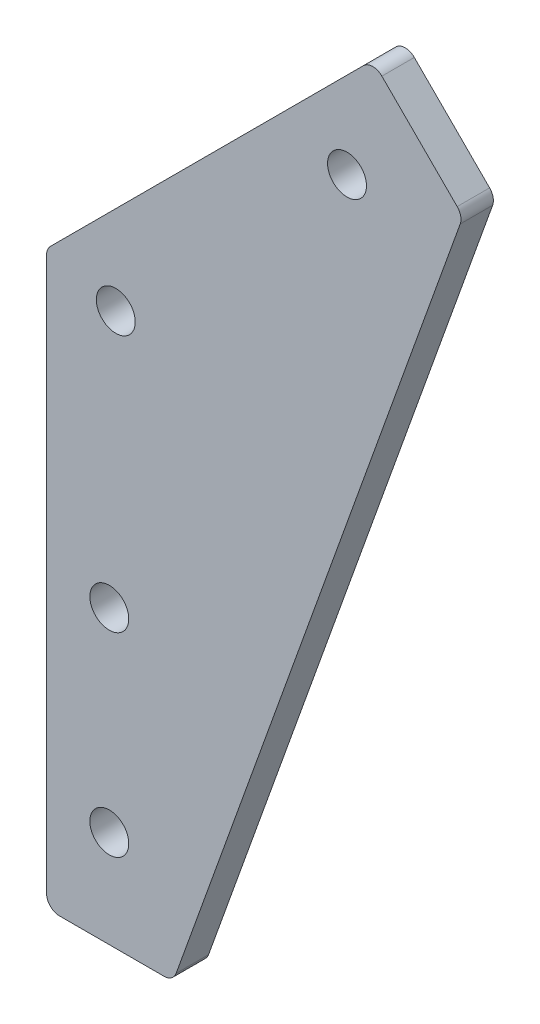
ISO-10303-21;
HEADER;
FILE_DESCRIPTION(('STEP AP214'),'2;1');
FILE_NAME('part.step','',(''),(''),'','','');
FILE_SCHEMA(('AUTOMOTIVE_DESIGN { 1 0 10303 214 1 1 1 1 }'));
ENDSEC;
DATA;
#1=APPLICATION_CONTEXT('core data for automotive mechanical design processes');
#2=APPLICATION_PROTOCOL_DEFINITION('international standard','automotive_design',2000,#1);
#3=PRODUCT_CONTEXT('',#1,'mechanical');
#4=PRODUCT('Part','Part','',(#3));
#5=PRODUCT_RELATED_PRODUCT_CATEGORY('part','',(#4));
#6=PRODUCT_DEFINITION_FORMATION('','',#4);
#7=PRODUCT_DEFINITION_CONTEXT('part definition',#1,'design');
#8=PRODUCT_DEFINITION('design','',#6,#7);
#9=PRODUCT_DEFINITION_SHAPE('','',#8);
#10=(LENGTH_UNIT() NAMED_UNIT(*) SI_UNIT(.MILLI.,.METRE.));
#11=(NAMED_UNIT(*) PLANE_ANGLE_UNIT() SI_UNIT($,.RADIAN.));
#12=(NAMED_UNIT(*) SI_UNIT($,.STERADIAN.) SOLID_ANGLE_UNIT());
#13=UNCERTAINTY_MEASURE_WITH_UNIT(LENGTH_MEASURE(1.E-05),#10,'distance_accuracy_value','');
#14=(GEOMETRIC_REPRESENTATION_CONTEXT(3) GLOBAL_UNCERTAINTY_ASSIGNED_CONTEXT((#13)) GLOBAL_UNIT_ASSIGNED_CONTEXT((#10,
#11,#12)) REPRESENTATION_CONTEXT('',''));
#15=CARTESIAN_POINT('',(0.,0.,0.));
#16=DIRECTION('',(0.,0.,1.));
#17=DIRECTION('',(1.,0.,0.));
#18=AXIS2_PLACEMENT_3D('',#15,#16,#17);
#19=CARTESIAN_POINT('',(12.4503702457408,68.7965035766205,1.));
#20=DIRECTION('',(0.,0.,1.));
#21=DIRECTION('',(1.,0.,0.));
#22=AXIS2_PLACEMENT_3D('',#19,#20,#21);
#23=PLANE('',#22);
#24=CARTESIAN_POINT('',(-9.83,15.,1.));
#25=DIRECTION('',(0.,0.,-1.));
#26=DIRECTION('',(1.,0.,0.));
#27=AXIS2_PLACEMENT_3D('',#24,#25,#26);
#28=CIRCLE('',#27,3.);
#29=CARTESIAN_POINT('',(-6.83,15.,1.));
#30=VERTEX_POINT('',#29);
#31=EDGE_CURVE('E11',#30,#30,#28,.T.);
#32=ORIENTED_EDGE('',*,*,#31,.T.);
#33=EDGE_LOOP('',(#32));
#34=FACE_BOUND('',#33,.T.);
#35=CARTESIAN_POINT('',(-9.83,45.,1.));
#36=DIRECTION('',(0.,0.,-1.));
#37=DIRECTION('',(1.,0.,0.));
#38=AXIS2_PLACEMENT_3D('',#35,#36,#37);
#39=CIRCLE('',#38,3.);
#40=CARTESIAN_POINT('',(-6.83,45.,1.));
#41=VERTEX_POINT('',#40);
#42=EDGE_CURVE('E23',#41,#41,#39,.T.);
#43=ORIENTED_EDGE('',*,*,#42,.T.);
#44=EDGE_LOOP('',(#43));
#45=FACE_BOUND('',#44,.T.);
#46=CARTESIAN_POINT('',(-8.83,85.15,1.));
#47=DIRECTION('',(0.,0.,-1.));
#48=DIRECTION('',(1.,0.,0.));
#49=AXIS2_PLACEMENT_3D('',#46,#47,#48);
#50=CIRCLE('',#49,3.);
#51=CARTESIAN_POINT('',(-5.83,85.15,1.));
#52=VERTEX_POINT('',#51);
#53=EDGE_CURVE('E244',#52,#52,#50,.T.);
#54=ORIENTED_EDGE('',*,*,#53,.T.);
#55=EDGE_LOOP('',(#54));
#56=FACE_BOUND('',#55,.T.);
#57=CARTESIAN_POINT('',(26.8247068584462,121.172958261932,1.));
#58=DIRECTION('',(0.,0.,-1.));
#59=DIRECTION('',(1.,0.,0.));
#60=AXIS2_PLACEMENT_3D('',#57,#58,#59);
#61=CIRCLE('',#60,3.);
#62=CARTESIAN_POINT('',(29.8247068584462,121.172958261932,1.));
#63=VERTEX_POINT('',#62);
#64=EDGE_CURVE('E239',#63,#63,#61,.T.);
#65=ORIENTED_EDGE('',*,*,#64,.T.);
#66=EDGE_LOOP('',(#65));
#67=FACE_BOUND('',#66,.T.);
#68=CARTESIAN_POINT('',(30.7894342779873,135.593007153241,1.));
#69=DIRECTION('',(0.,0.,1.));
#70=DIRECTION('',(0.707106781186543,0.707106781186552,0.));
#71=AXIS2_PLACEMENT_3D('',#68,#69,#70);
#72=CIRCLE('',#71,2.);
#73=CARTESIAN_POINT('',(32.2036478403604,137.007220715614,1.));
#74=VERTEX_POINT('',#73);
#75=CARTESIAN_POINT('',(29.3752207156142,137.007220715614,1.));
#76=VERTEX_POINT('',#75);
#77=EDGE_CURVE('E30',#74,#76,#72,.T.);
#78=ORIENTED_EDGE('',*,*,#77,.T.);
#79=DIRECTION('',(-0.707106781186548,-0.707106781186547,0.));
#80=VECTOR('',#79,1.);
#81=CARTESIAN_POINT('',(-18.9142135623731,88.7177864376269,1.));
#82=LINE('',#81,#80);
#83=CARTESIAN_POINT('',(-18.9142135623731,88.7177864376269,1.));
#84=VERTEX_POINT('',#83);
#85=EDGE_CURVE('E35',#76,#84,#82,.T.);
#86=ORIENTED_EDGE('',*,*,#85,.T.);
#87=CARTESIAN_POINT('',(-17.5,87.3035728752538,1.));
#88=DIRECTION('',(0.,0.,1.));
#89=DIRECTION('',(-0.707106781186539,0.707106781186556,0.));
#90=AXIS2_PLACEMENT_3D('',#87,#88,#89);
#91=CIRCLE('',#90,1.99999999999995);
#92=CARTESIAN_POINT('',(-19.5,87.3035728752538,1.));
#93=VERTEX_POINT('',#92);
#94=EDGE_CURVE('E229',#84,#93,#91,.T.);
#95=ORIENTED_EDGE('',*,*,#94,.T.);
#96=DIRECTION('',(0.,-1.,0.));
#97=VECTOR('',#96,1.);
#98=CARTESIAN_POINT('',(-19.5,2.,1.));
#99=LINE('',#98,#97);
#100=CARTESIAN_POINT('',(-19.5,2.,1.));
#101=VERTEX_POINT('',#100);
#102=EDGE_CURVE('E225',#93,#101,#99,.T.);
#103=ORIENTED_EDGE('',*,*,#102,.T.);
#104=CARTESIAN_POINT('',(-17.5,2.,1.));
#105=DIRECTION('',(0.,0.,1.));
#106=DIRECTION('',(-1.,0.,0.));
#107=AXIS2_PLACEMENT_3D('',#104,#105,#106);
#108=CIRCLE('',#107,2.);
#109=CARTESIAN_POINT('',(-17.5,0.,1.));
#110=VERTEX_POINT('',#109);
#111=EDGE_CURVE('E221',#101,#110,#108,.T.);
#112=ORIENTED_EDGE('',*,*,#111,.T.);
#113=DIRECTION('',(1.,0.,0.));
#114=VECTOR('',#113,1.);
#115=CARTESIAN_POINT('',(-1.40680134724384,0.,1.));
#116=LINE('',#115,#114);
#117=CARTESIAN_POINT('',(-1.40680134724384,0.,1.));
#118=VERTEX_POINT('',#117);
#119=EDGE_CURVE('E217',#110,#118,#116,.T.);
#120=ORIENTED_EDGE('',*,*,#119,.T.);
#121=CARTESIAN_POINT('',(-1.40680134724384,2.,1.));
#122=DIRECTION('',(0.,0.,1.));
#123=DIRECTION('',(0.,-1.,0.));
#124=AXIS2_PLACEMENT_3D('',#121,#122,#123);
#125=CIRCLE('',#124,2.);
#126=CARTESIAN_POINT('',(0.47549357060138,1.32400751316744,1.));
#127=VERTEX_POINT('',#126);
#128=EDGE_CURVE('E213',#118,#127,#125,.T.);
#129=ORIENTED_EDGE('',*,*,#128,.T.);
#130=DIRECTION('',(0.337996243416279,0.941147458922609,0.));
#131=VECTOR('',#130,1.);
#132=CARTESIAN_POINT('',(0.475493570601379,1.32400751316744,1.));
#133=LINE('',#132,#131);
#134=CARTESIAN_POINT('',(44.2830354093269,123.305708452914,1.));
#135=VERTEX_POINT('',#134);
#136=EDGE_CURVE('E209',#127,#135,#133,.T.);
#137=ORIENTED_EDGE('',*,*,#136,.T.);
#138=CARTESIAN_POINT('',(42.4007404914815,123.981700939747,1.));
#139=DIRECTION('',(0.,0.,1.));
#140=DIRECTION('',(0.94114745892262,-0.337996243416249,0.));
#141=AXIS2_PLACEMENT_3D('',#138,#139,#140);
#142=CIRCLE('',#141,2.00000000000015);
#143=CARTESIAN_POINT('',(43.8149540538548,125.39591450212,1.));
#144=VERTEX_POINT('',#143);
#145=EDGE_CURVE('E205',#135,#144,#142,.T.);
#146=ORIENTED_EDGE('',*,*,#145,.T.);
#147=DIRECTION('',(-0.707106781186548,0.707106781186547,0.));
#148=VECTOR('',#147,1.);
#149=CARTESIAN_POINT('',(32.2036478403604,137.007220715614,1.));
#150=LINE('',#149,#148);
#151=EDGE_CURVE('E110',#144,#74,#150,.T.);
#152=ORIENTED_EDGE('',*,*,#151,.T.);
#153=EDGE_LOOP('',(#78,#86,#95,#103,#112,#120,#129,#137,#146,#152));
#154=FACE_BOUND('',#153,.T.);
#155=ADVANCED_FACE('F16',(#34,#45,#56,#67,#154),#23,.T.);
#156=CARTESIAN_POINT('',(30.7894342779873,135.593007153241,0.));
#157=DIRECTION('',(0.,0.,1.));
#158=DIRECTION('',(0.707106781186543,0.707106781186552,0.));
#159=AXIS2_PLACEMENT_3D('',#156,#157,#158);
#160=CYLINDRICAL_SURFACE('',#159,2.);
#161=DIRECTION('',(0.,0.,1.));
#162=VECTOR('',#161,1.);
#163=CARTESIAN_POINT('',(29.3752207156142,137.007220715614,0.));
#164=LINE('',#163,#162);
#165=CARTESIAN_POINT('',(29.3752207156142,137.007220715614,-4.));
#166=VERTEX_POINT('',#165);
#167=EDGE_CURVE('E198',#166,#76,#164,.T.);
#168=ORIENTED_EDGE('',*,*,#167,.T.);
#169=ORIENTED_EDGE('',*,*,#77,.F.);
#170=DIRECTION('',(0.,0.,-1.));
#171=VECTOR('',#170,1.);
#172=CARTESIAN_POINT('',(32.2036478403604,137.007220715614,0.));
#173=LINE('',#172,#171);
#174=CARTESIAN_POINT('',(32.2036478403604,137.007220715614,-4.));
#175=VERTEX_POINT('',#174);
#176=EDGE_CURVE('E194',#74,#175,#173,.T.);
#177=ORIENTED_EDGE('',*,*,#176,.T.);
#178=CARTESIAN_POINT('',(30.7894342779873,135.593007153241,-4.));
#179=DIRECTION('',(0.,0.,-1.));
#180=DIRECTION('',(0.707106781186543,0.707106781186552,0.));
#181=AXIS2_PLACEMENT_3D('',#178,#179,#180);
#182=CIRCLE('',#181,2.);
#183=EDGE_CURVE('E115',#166,#175,#182,.T.);
#184=ORIENTED_EDGE('',*,*,#183,.F.);
#185=EDGE_LOOP('',(#168,#169,#177,#184));
#186=FACE_BOUND('',#185,.T.);
#187=ADVANCED_FACE('F269',(#186),#160,.T.);
#188=CARTESIAN_POINT('',(29.3752207156142,137.007220715614,0.));
#189=DIRECTION('',(-0.707106781186547,0.707106781186548,0.));
#190=DIRECTION('',(-0.707106781186548,-0.707106781186547,0.));
#191=AXIS2_PLACEMENT_3D('',#188,#189,#190);
#192=PLANE('',#191);
#193=DIRECTION('',(0.,0.,1.));
#194=VECTOR('',#193,1.);
#195=CARTESIAN_POINT('',(-18.9142135623731,88.7177864376269,0.));
#196=LINE('',#195,#194);
#197=CARTESIAN_POINT('',(-18.9142135623731,88.7177864376269,-4.));
#198=VERTEX_POINT('',#197);
#199=EDGE_CURVE('E187',#198,#84,#196,.T.);
#200=ORIENTED_EDGE('',*,*,#199,.T.);
#201=ORIENTED_EDGE('',*,*,#85,.F.);
#202=ORIENTED_EDGE('',*,*,#167,.F.);
#203=DIRECTION('',(0.707106781186548,0.707106781186547,0.));
#204=VECTOR('',#203,1.);
#205=CARTESIAN_POINT('',(-18.9142135623731,88.7177864376269,-4.));
#206=LINE('',#205,#204);
#207=EDGE_CURVE('E183',#198,#166,#206,.T.);
#208=ORIENTED_EDGE('',*,*,#207,.F.);
#209=EDGE_LOOP('',(#200,#201,#202,#208));
#210=FACE_BOUND('',#209,.T.);
#211=ADVANCED_FACE('F274',(#210),#192,.T.);
#212=CARTESIAN_POINT('',(-17.5,87.3035728752538,0.));
#213=DIRECTION('',(0.,0.,1.));
#214=DIRECTION('',(-0.707106781186539,0.707106781186556,0.));
#215=AXIS2_PLACEMENT_3D('',#212,#213,#214);
#216=CYLINDRICAL_SURFACE('',#215,1.99999999999995);
#217=DIRECTION('',(0.,0.,1.));
#218=VECTOR('',#217,1.);
#219=CARTESIAN_POINT('',(-19.5,87.3035728752538,0.));
#220=LINE('',#219,#218);
#221=CARTESIAN_POINT('',(-19.5,87.3035728752538,-4.));
#222=VERTEX_POINT('',#221);
#223=EDGE_CURVE('E178',#222,#93,#220,.T.);
#224=ORIENTED_EDGE('',*,*,#223,.T.);
#225=ORIENTED_EDGE('',*,*,#94,.F.);
#226=ORIENTED_EDGE('',*,*,#199,.F.);
#227=CARTESIAN_POINT('',(-17.5,87.3035728752538,-4.));
#228=DIRECTION('',(0.,0.,-1.));
#229=DIRECTION('',(-0.707106781186539,0.707106781186556,0.));
#230=AXIS2_PLACEMENT_3D('',#227,#228,#229);
#231=CIRCLE('',#230,1.99999999999995);
#232=EDGE_CURVE('E173',#222,#198,#231,.T.);
#233=ORIENTED_EDGE('',*,*,#232,.F.);
#234=EDGE_LOOP('',(#224,#225,#226,#233));
#235=FACE_BOUND('',#234,.T.);
#236=ADVANCED_FACE('F281',(#235),#216,.T.);
#237=CARTESIAN_POINT('',(-19.5,87.3035728752538,0.));
#238=DIRECTION('',(-1.,0.,0.));
#239=DIRECTION('',(0.,-1.,0.));
#240=AXIS2_PLACEMENT_3D('',#237,#238,#239);
#241=PLANE('',#240);
#242=DIRECTION('',(0.,0.,1.));
#243=VECTOR('',#242,1.);
#244=CARTESIAN_POINT('',(-19.5,2.,0.));
#245=LINE('',#244,#243);
#246=CARTESIAN_POINT('',(-19.5,2.,-4.));
#247=VERTEX_POINT('',#246);
#248=EDGE_CURVE('E168',#247,#101,#245,.T.);
#249=ORIENTED_EDGE('',*,*,#248,.T.);
#250=ORIENTED_EDGE('',*,*,#102,.F.);
#251=ORIENTED_EDGE('',*,*,#223,.F.);
#252=DIRECTION('',(0.,1.,0.));
#253=VECTOR('',#252,1.);
#254=CARTESIAN_POINT('',(-19.5,2.,-4.));
#255=LINE('',#254,#253);
#256=EDGE_CURVE('E163',#247,#222,#255,.T.);
#257=ORIENTED_EDGE('',*,*,#256,.F.);
#258=EDGE_LOOP('',(#249,#250,#251,#257));
#259=FACE_BOUND('',#258,.T.);
#260=ADVANCED_FACE('F287',(#259),#241,.T.);
#261=CARTESIAN_POINT('',(-17.5,2.,0.));
#262=DIRECTION('',(0.,0.,1.));
#263=DIRECTION('',(-1.,0.,0.));
#264=AXIS2_PLACEMENT_3D('',#261,#262,#263);
#265=CYLINDRICAL_SURFACE('',#264,2.);
#266=DIRECTION('',(0.,0.,1.));
#267=VECTOR('',#266,1.);
#268=CARTESIAN_POINT('',(-17.5,0.,0.));
#269=LINE('',#268,#267);
#270=CARTESIAN_POINT('',(-17.5,0.,-4.));
#271=VERTEX_POINT('',#270);
#272=EDGE_CURVE('E158',#271,#110,#269,.T.);
#273=ORIENTED_EDGE('',*,*,#272,.T.);
#274=ORIENTED_EDGE('',*,*,#111,.F.);
#275=ORIENTED_EDGE('',*,*,#248,.F.);
#276=CARTESIAN_POINT('',(-17.5,2.,-4.));
#277=DIRECTION('',(0.,0.,-1.));
#278=DIRECTION('',(-1.,0.,0.));
#279=AXIS2_PLACEMENT_3D('',#276,#277,#278);
#280=CIRCLE('',#279,2.);
#281=EDGE_CURVE('E153',#271,#247,#280,.T.);
#282=ORIENTED_EDGE('',*,*,#281,.F.);
#283=EDGE_LOOP('',(#273,#274,#275,#282));
#284=FACE_BOUND('',#283,.T.);
#285=ADVANCED_FACE('F291',(#284),#265,.T.);
#286=CARTESIAN_POINT('',(-17.5,0.,0.));
#287=DIRECTION('',(0.,-1.,0.));
#288=DIRECTION('',(1.,0.,0.));
#289=AXIS2_PLACEMENT_3D('',#286,#287,#288);
#290=PLANE('',#289);
#291=DIRECTION('',(0.,0.,1.));
#292=VECTOR('',#291,1.);
#293=CARTESIAN_POINT('',(-1.40680134724384,0.,0.));
#294=LINE('',#293,#292);
#295=CARTESIAN_POINT('',(-1.40680134724384,0.,-4.));
#296=VERTEX_POINT('',#295);
#297=EDGE_CURVE('E148',#296,#118,#294,.T.);
#298=ORIENTED_EDGE('',*,*,#297,.T.);
#299=ORIENTED_EDGE('',*,*,#119,.F.);
#300=ORIENTED_EDGE('',*,*,#272,.F.);
#301=DIRECTION('',(-1.,0.,0.));
#302=VECTOR('',#301,1.);
#303=CARTESIAN_POINT('',(-1.40680134724384,0.,-4.));
#304=LINE('',#303,#302);
#305=EDGE_CURVE('E143',#296,#271,#304,.T.);
#306=ORIENTED_EDGE('',*,*,#305,.F.);
#307=EDGE_LOOP('',(#298,#299,#300,#306));
#308=FACE_BOUND('',#307,.T.);
#309=ADVANCED_FACE('F295',(#308),#290,.T.);
#310=CARTESIAN_POINT('',(-1.40680134724384,2.,0.));
#311=DIRECTION('',(0.,0.,1.));
#312=DIRECTION('',(0.,-1.,0.));
#313=AXIS2_PLACEMENT_3D('',#310,#311,#312);
#314=CYLINDRICAL_SURFACE('',#313,2.);
#315=DIRECTION('',(0.,0.,1.));
#316=VECTOR('',#315,1.);
#317=CARTESIAN_POINT('',(0.475493570601378,1.32400751316744,0.));
#318=LINE('',#317,#316);
#319=CARTESIAN_POINT('',(0.47549357060138,1.32400751316744,-4.));
#320=VERTEX_POINT('',#319);
#321=EDGE_CURVE('E138',#320,#127,#318,.T.);
#322=ORIENTED_EDGE('',*,*,#321,.T.);
#323=ORIENTED_EDGE('',*,*,#128,.F.);
#324=ORIENTED_EDGE('',*,*,#297,.F.);
#325=CARTESIAN_POINT('',(-1.40680134724384,2.,-4.));
#326=DIRECTION('',(0.,0.,-1.));
#327=DIRECTION('',(0.,-1.,0.));
#328=AXIS2_PLACEMENT_3D('',#325,#326,#327);
#329=CIRCLE('',#328,2.);
#330=EDGE_CURVE('E133',#320,#296,#329,.T.);
#331=ORIENTED_EDGE('',*,*,#330,.F.);
#332=EDGE_LOOP('',(#322,#323,#324,#331));
#333=FACE_BOUND('',#332,.T.);
#334=ADVANCED_FACE('F299',(#333),#314,.T.);
#335=CARTESIAN_POINT('',(0.475493570601379,1.32400751316744,0.));
#336=DIRECTION('',(0.941147458922609,-0.337996243416279,0.));
#337=DIRECTION('',(0.337996243416279,0.941147458922609,0.));
#338=AXIS2_PLACEMENT_3D('',#335,#336,#337);
#339=PLANE('',#338);
#340=DIRECTION('',(0.,0.,1.));
#341=VECTOR('',#340,1.);
#342=CARTESIAN_POINT('',(44.2830354093269,123.305708452914,0.));
#343=LINE('',#342,#341);
#344=CARTESIAN_POINT('',(44.2830354093269,123.305708452914,-4.));
#345=VERTEX_POINT('',#344);
#346=EDGE_CURVE('E99',#345,#135,#343,.T.);
#347=ORIENTED_EDGE('',*,*,#346,.T.);
#348=ORIENTED_EDGE('',*,*,#136,.F.);
#349=ORIENTED_EDGE('',*,*,#321,.F.);
#350=DIRECTION('',(-0.337996243416279,-0.941147458922609,0.));
#351=VECTOR('',#350,1.);
#352=CARTESIAN_POINT('',(0.475493570601379,1.32400751316744,-4.));
#353=LINE('',#352,#351);
#354=EDGE_CURVE('E111',#345,#320,#353,.T.);
#355=ORIENTED_EDGE('',*,*,#354,.F.);
#356=EDGE_LOOP('',(#347,#348,#349,#355));
#357=FACE_BOUND('',#356,.T.);
#358=ADVANCED_FACE('F303',(#357),#339,.T.);
#359=CARTESIAN_POINT('',(42.4007404914815,123.981700939747,0.));
#360=DIRECTION('',(0.,0.,1.));
#361=DIRECTION('',(0.94114745892262,-0.337996243416249,0.));
#362=AXIS2_PLACEMENT_3D('',#359,#360,#361);
#363=CYLINDRICAL_SURFACE('',#362,2.00000000000015);
#364=DIRECTION('',(0.,0.,1.));
#365=VECTOR('',#364,1.);
#366=CARTESIAN_POINT('',(43.8149540538548,125.39591450212,0.));
#367=LINE('',#366,#365);
#368=CARTESIAN_POINT('',(43.8149540538548,125.39591450212,-4.));
#369=VERTEX_POINT('',#368);
#370=EDGE_CURVE('E96',#369,#144,#367,.T.);
#371=ORIENTED_EDGE('',*,*,#370,.T.);
#372=ORIENTED_EDGE('',*,*,#145,.F.);
#373=ORIENTED_EDGE('',*,*,#346,.F.);
#374=CARTESIAN_POINT('',(42.4007404914815,123.981700939747,-4.));
#375=DIRECTION('',(0.,0.,-1.));
#376=DIRECTION('',(0.94114745892262,-0.337996243416249,0.));
#377=AXIS2_PLACEMENT_3D('',#374,#375,#376);
#378=CIRCLE('',#377,2.00000000000015);
#379=EDGE_CURVE('E92',#369,#345,#378,.T.);
#380=ORIENTED_EDGE('',*,*,#379,.F.);
#381=EDGE_LOOP('',(#371,#372,#373,#380));
#382=FACE_BOUND('',#381,.T.);
#383=ADVANCED_FACE('F94',(#382),#363,.T.);
#384=CARTESIAN_POINT('',(43.8149540538548,125.39591450212,0.));
#385=DIRECTION('',(0.707106781186547,0.707106781186548,0.));
#386=DIRECTION('',(-0.707106781186548,0.707106781186547,0.));
#387=AXIS2_PLACEMENT_3D('',#384,#385,#386);
#388=PLANE('',#387);
#389=ORIENTED_EDGE('',*,*,#176,.F.);
#390=ORIENTED_EDGE('',*,*,#151,.F.);
#391=ORIENTED_EDGE('',*,*,#370,.F.);
#392=DIRECTION('',(0.707106781186548,-0.707106781186547,0.));
#393=VECTOR('',#392,1.);
#394=CARTESIAN_POINT('',(32.2036478403604,137.007220715614,-4.));
#395=LINE('',#394,#393);
#396=EDGE_CURVE('E103',#175,#369,#395,.T.);
#397=ORIENTED_EDGE('',*,*,#396,.F.);
#398=EDGE_LOOP('',(#389,#390,#391,#397));
#399=FACE_BOUND('',#398,.T.);
#400=ADVANCED_FACE('F108',(#399),#388,.T.);
#401=CARTESIAN_POINT('',(26.8247068584462,121.172958261932,0.));
#402=DIRECTION('',(0.,0.,1.));
#403=DIRECTION('',(1.,0.,0.));
#404=AXIS2_PLACEMENT_3D('',#401,#402,#403);
#405=CYLINDRICAL_SURFACE('',#404,3.);
#406=CARTESIAN_POINT('',(26.8247068584462,121.172958261932,-4.));
#407=DIRECTION('',(0.,0.,1.));
#408=DIRECTION('',(1.,0.,0.));
#409=AXIS2_PLACEMENT_3D('',#406,#407,#408);
#410=CIRCLE('',#409,3.);
#411=CARTESIAN_POINT('',(29.8247068584462,121.172958261932,-4.));
#412=VERTEX_POINT('',#411);
#413=EDGE_CURVE('E116',#412,#412,#410,.T.);
#414=ORIENTED_EDGE('',*,*,#413,.F.);
#415=EDGE_LOOP('',(#414));
#416=FACE_BOUND('',#415,.T.);
#417=ORIENTED_EDGE('',*,*,#64,.F.);
#418=EDGE_LOOP('',(#417));
#419=FACE_BOUND('',#418,.T.);
#420=ADVANCED_FACE('F264',(#416,#419),#405,.F.);
#421=CARTESIAN_POINT('',(-8.83,85.15,0.));
#422=DIRECTION('',(0.,0.,1.));
#423=DIRECTION('',(1.,0.,0.));
#424=AXIS2_PLACEMENT_3D('',#421,#422,#423);
#425=CYLINDRICAL_SURFACE('',#424,3.);
#426=CARTESIAN_POINT('',(-8.83,85.15,-4.));
#427=DIRECTION('',(0.,0.,1.));
#428=DIRECTION('',(1.,0.,0.));
#429=AXIS2_PLACEMENT_3D('',#426,#427,#428);
#430=CIRCLE('',#429,3.);
#431=CARTESIAN_POINT('',(-5.83,85.15,-4.));
#432=VERTEX_POINT('',#431);
#433=EDGE_CURVE('E119',#432,#432,#430,.T.);
#434=ORIENTED_EDGE('',*,*,#433,.F.);
#435=EDGE_LOOP('',(#434));
#436=FACE_BOUND('',#435,.T.);
#437=ORIENTED_EDGE('',*,*,#53,.F.);
#438=EDGE_LOOP('',(#437));
#439=FACE_BOUND('',#438,.T.);
#440=ADVANCED_FACE('F254',(#436,#439),#425,.F.);
#441=CARTESIAN_POINT('',(-9.83,45.,0.));
#442=DIRECTION('',(0.,0.,1.));
#443=DIRECTION('',(1.,0.,0.));
#444=AXIS2_PLACEMENT_3D('',#441,#442,#443);
#445=CYLINDRICAL_SURFACE('',#444,3.);
#446=CARTESIAN_POINT('',(-9.83,45.,-4.));
#447=DIRECTION('',(0.,0.,1.));
#448=DIRECTION('',(1.,0.,0.));
#449=AXIS2_PLACEMENT_3D('',#446,#447,#448);
#450=CIRCLE('',#449,3.);
#451=CARTESIAN_POINT('',(-6.83,45.,-4.));
#452=VERTEX_POINT('',#451);
#453=EDGE_CURVE('E332',#452,#452,#450,.T.);
#454=ORIENTED_EDGE('',*,*,#453,.F.);
#455=EDGE_LOOP('',(#454));
#456=FACE_BOUND('',#455,.T.);
#457=ORIENTED_EDGE('',*,*,#42,.F.);
#458=EDGE_LOOP('',(#457));
#459=FACE_BOUND('',#458,.T.);
#460=ADVANCED_FACE('F251',(#456,#459),#445,.F.);
#461=CARTESIAN_POINT('',(-9.83,15.,0.));
#462=DIRECTION('',(0.,0.,1.));
#463=DIRECTION('',(1.,0.,0.));
#464=AXIS2_PLACEMENT_3D('',#461,#462,#463);
#465=CYLINDRICAL_SURFACE('',#464,3.);
#466=CARTESIAN_POINT('',(-9.83,15.,-4.));
#467=DIRECTION('',(0.,0.,1.));
#468=DIRECTION('',(1.,0.,0.));
#469=AXIS2_PLACEMENT_3D('',#466,#467,#468);
#470=CIRCLE('',#469,3.);
#471=CARTESIAN_POINT('',(-6.83,15.,-4.));
#472=VERTEX_POINT('',#471);
#473=EDGE_CURVE('E329',#472,#472,#470,.T.);
#474=ORIENTED_EDGE('',*,*,#473,.F.);
#475=EDGE_LOOP('',(#474));
#476=FACE_BOUND('',#475,.T.);
#477=ORIENTED_EDGE('',*,*,#31,.F.);
#478=EDGE_LOOP('',(#477));
#479=FACE_BOUND('',#478,.T.);
#480=ADVANCED_FACE('F253',(#476,#479),#465,.F.);
#481=CARTESIAN_POINT('',(12.4503702457408,68.7965035766205,-4.));
#482=DIRECTION('',(0.,0.,1.));
#483=DIRECTION('',(1.,0.,0.));
#484=AXIS2_PLACEMENT_3D('',#481,#482,#483);
#485=PLANE('',#484);
#486=ORIENTED_EDGE('',*,*,#473,.T.);
#487=EDGE_LOOP('',(#486));
#488=FACE_BOUND('',#487,.T.);
#489=ORIENTED_EDGE('',*,*,#453,.T.);
#490=EDGE_LOOP('',(#489));
#491=FACE_BOUND('',#490,.T.);
#492=ORIENTED_EDGE('',*,*,#433,.T.);
#493=EDGE_LOOP('',(#492));
#494=FACE_BOUND('',#493,.T.);
#495=ORIENTED_EDGE('',*,*,#413,.T.);
#496=EDGE_LOOP('',(#495));
#497=FACE_BOUND('',#496,.T.);
#498=ORIENTED_EDGE('',*,*,#183,.T.);
#499=ORIENTED_EDGE('',*,*,#396,.T.);
#500=ORIENTED_EDGE('',*,*,#379,.T.);
#501=ORIENTED_EDGE('',*,*,#354,.T.);
#502=ORIENTED_EDGE('',*,*,#330,.T.);
#503=ORIENTED_EDGE('',*,*,#305,.T.);
#504=ORIENTED_EDGE('',*,*,#281,.T.);
#505=ORIENTED_EDGE('',*,*,#256,.T.);
#506=ORIENTED_EDGE('',*,*,#232,.T.);
#507=ORIENTED_EDGE('',*,*,#207,.T.);
#508=EDGE_LOOP('',(#498,#499,#500,#501,#502,#503,#504,#505,#506,#507));
#509=FACE_BOUND('',#508,.T.);
#510=ADVANCED_FACE('F113',(#488,#491,#494,#497,#509),#485,.F.);
#511=CLOSED_SHELL('',(#155,#187,#211,#236,#260,#285,#309,#334,#358,#383,#400,#420,#440,#460,
#480,#510));
#512=MANIFOLD_SOLID_BREP('B1',#511);
#513=ADVANCED_BREP_SHAPE_REPRESENTATION('',(#18,#512),#14);
#514=SHAPE_DEFINITION_REPRESENTATION(#9,#513);
ENDSEC;
END-ISO-10303-21;
